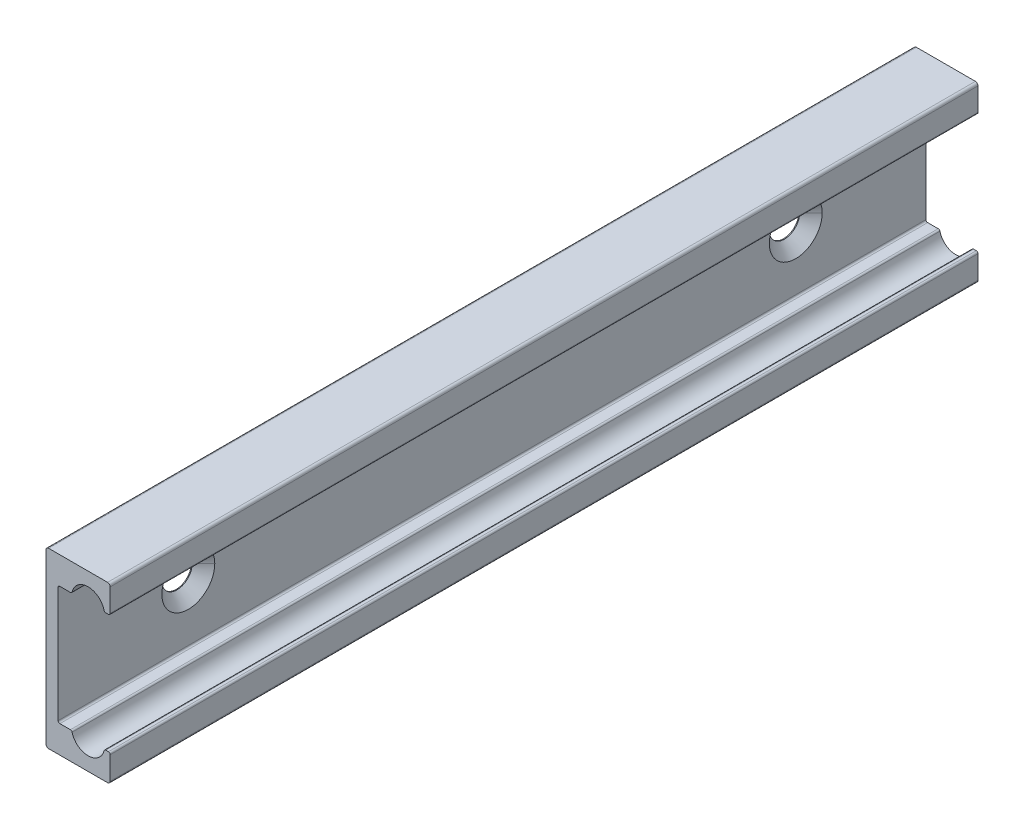
ISO-10303-21;
HEADER;
FILE_DESCRIPTION(('STEP AP214'),'2;1');
FILE_NAME('part.step','',(''),(''),'','','');
FILE_SCHEMA(('AUTOMOTIVE_DESIGN { 1 0 10303 214 1 1 1 1 }'));
ENDSEC;
DATA;
#1=APPLICATION_CONTEXT('core data for automotive mechanical design processes');
#2=APPLICATION_PROTOCOL_DEFINITION('international standard','automotive_design',2000,#1);
#3=PRODUCT_CONTEXT('',#1,'mechanical');
#4=PRODUCT('Part','Part','',(#3));
#5=PRODUCT_RELATED_PRODUCT_CATEGORY('part','',(#4));
#6=PRODUCT_DEFINITION_FORMATION('','',#4);
#7=PRODUCT_DEFINITION_CONTEXT('part definition',#1,'design');
#8=PRODUCT_DEFINITION('design','',#6,#7);
#9=PRODUCT_DEFINITION_SHAPE('','',#8);
#10=(LENGTH_UNIT() NAMED_UNIT(*) SI_UNIT(.MILLI.,.METRE.));
#11=(NAMED_UNIT(*) PLANE_ANGLE_UNIT() SI_UNIT($,.RADIAN.));
#12=(NAMED_UNIT(*) SI_UNIT($,.STERADIAN.) SOLID_ANGLE_UNIT());
#13=UNCERTAINTY_MEASURE_WITH_UNIT(LENGTH_MEASURE(1.E-05),#10,'distance_accuracy_value','');
#14=(GEOMETRIC_REPRESENTATION_CONTEXT(3) GLOBAL_UNCERTAINTY_ASSIGNED_CONTEXT((#13)) GLOBAL_UNIT_ASSIGNED_CONTEXT((#10,
#11,#12)) REPRESENTATION_CONTEXT('',''));
#15=CARTESIAN_POINT('',(0.,0.,0.));
#16=DIRECTION('',(0.,0.,1.));
#17=DIRECTION('',(1.,0.,0.));
#18=AXIS2_PLACEMENT_3D('',#15,#16,#17);
#19=CARTESIAN_POINT('',(-7.10000000000012,19.7,100.));
#20=DIRECTION('',(0.,0.,-1.));
#21=DIRECTION('',(0.707106781186406,-0.707106781186689,0.));
#22=AXIS2_PLACEMENT_3D('',#19,#20,#21);
#23=CYLINDRICAL_SURFACE('',#22,0.29999999999988);
#24=CARTESIAN_POINT('',(-7.10000000000012,19.7,0.));
#25=DIRECTION('',(0.,0.,1.));
#26=DIRECTION('',(1.,0.,0.));
#27=AXIS2_PLACEMENT_3D('',#24,#25,#26);
#28=CIRCLE('',#27,0.29999999999988);
#29=CARTESIAN_POINT('',(-7.1,20.,0.));
#30=VERTEX_POINT('',#29);
#31=CARTESIAN_POINT('',(-7.4,19.7,0.));
#32=VERTEX_POINT('',#31);
#33=EDGE_CURVE('E11',#30,#32,#28,.T.);
#34=ORIENTED_EDGE('',*,*,#33,.T.);
#35=DIRECTION('',(0.,0.,-1.));
#36=VECTOR('',#35,1.);
#37=CARTESIAN_POINT('',(-7.4,19.7,100.));
#38=LINE('',#37,#36);
#39=CARTESIAN_POINT('',(-7.4,19.7,100.));
#40=VERTEX_POINT('',#39);
#41=EDGE_CURVE('E25',#40,#32,#38,.T.);
#42=ORIENTED_EDGE('',*,*,#41,.F.);
#43=CARTESIAN_POINT('',(-7.10000000000012,19.7,100.));
#44=DIRECTION('',(0.,0.,1.));
#45=DIRECTION('',(1.,0.,0.));
#46=AXIS2_PLACEMENT_3D('',#43,#44,#45);
#47=CIRCLE('',#46,0.29999999999988);
#48=CARTESIAN_POINT('',(-7.1,20.,100.));
#49=VERTEX_POINT('',#48);
#50=EDGE_CURVE('E627',#49,#40,#47,.T.);
#51=ORIENTED_EDGE('',*,*,#50,.F.);
#52=DIRECTION('',(0.,0.,-1.));
#53=VECTOR('',#52,1.);
#54=CARTESIAN_POINT('',(-7.1,20.,100.));
#55=LINE('',#54,#53);
#56=EDGE_CURVE('E623',#49,#30,#55,.T.);
#57=ORIENTED_EDGE('',*,*,#56,.T.);
#58=EDGE_LOOP('',(#34,#42,#51,#57));
#59=FACE_BOUND('',#58,.T.);
#60=ADVANCED_FACE('F17',(#59),#23,.T.);
#61=CARTESIAN_POINT('',(-0.3,20.,100.));
#62=DIRECTION('',(0.,-1.,0.));
#63=DIRECTION('',(0.,0.,-1.));
#64=AXIS2_PLACEMENT_3D('',#61,#62,#63);
#65=PLANE('',#64);
#66=DIRECTION('',(-1.,0.,0.));
#67=VECTOR('',#66,1.);
#68=CARTESIAN_POINT('',(-0.3,20.,0.));
#69=LINE('',#68,#67);
#70=CARTESIAN_POINT('',(-0.3,20.,0.));
#71=VERTEX_POINT('',#70);
#72=EDGE_CURVE('E618',#71,#30,#69,.T.);
#73=ORIENTED_EDGE('',*,*,#72,.T.);
#74=ORIENTED_EDGE('',*,*,#56,.F.);
#75=DIRECTION('',(-1.,0.,0.));
#76=VECTOR('',#75,1.);
#77=CARTESIAN_POINT('',(-0.3,20.,100.));
#78=LINE('',#77,#76);
#79=CARTESIAN_POINT('',(-0.3,20.,100.));
#80=VERTEX_POINT('',#79);
#81=EDGE_CURVE('E613',#80,#49,#78,.T.);
#82=ORIENTED_EDGE('',*,*,#81,.F.);
#83=DIRECTION('',(0.,0.,-1.));
#84=VECTOR('',#83,1.);
#85=CARTESIAN_POINT('',(-0.3,20.,100.));
#86=LINE('',#85,#84);
#87=EDGE_CURVE('E609',#80,#71,#86,.T.);
#88=ORIENTED_EDGE('',*,*,#87,.T.);
#89=EDGE_LOOP('',(#73,#74,#82,#88));
#90=FACE_BOUND('',#89,.T.);
#91=ADVANCED_FACE('F644',(#90),#65,.F.);
#92=CARTESIAN_POINT('',(-0.299999999999941,19.7,100.));
#93=DIRECTION('',(0.,0.,-1.));
#94=DIRECTION('',(-0.707106781186478,-0.707106781186617,0.));
#95=AXIS2_PLACEMENT_3D('',#92,#93,#94);
#96=CYLINDRICAL_SURFACE('',#95,0.299999999999941);
#97=CARTESIAN_POINT('',(-0.299999999999941,19.7,0.));
#98=DIRECTION('',(0.,0.,1.));
#99=DIRECTION('',(1.,0.,0.));
#100=AXIS2_PLACEMENT_3D('',#97,#98,#99);
#101=CIRCLE('',#100,0.299999999999941);
#102=CARTESIAN_POINT('',(0.,19.7,0.));
#103=VERTEX_POINT('',#102);
#104=EDGE_CURVE('E604',#103,#71,#101,.T.);
#105=ORIENTED_EDGE('',*,*,#104,.T.);
#106=ORIENTED_EDGE('',*,*,#87,.F.);
#107=CARTESIAN_POINT('',(-0.299999999999941,19.7,100.));
#108=DIRECTION('',(0.,0.,1.));
#109=DIRECTION('',(1.,0.,0.));
#110=AXIS2_PLACEMENT_3D('',#107,#108,#109);
#111=CIRCLE('',#110,0.299999999999941);
#112=CARTESIAN_POINT('',(0.,19.7,100.));
#113=VERTEX_POINT('',#112);
#114=EDGE_CURVE('E599',#113,#80,#111,.T.);
#115=ORIENTED_EDGE('',*,*,#114,.F.);
#116=DIRECTION('',(0.,0.,-1.));
#117=VECTOR('',#116,1.);
#118=CARTESIAN_POINT('',(0.,19.7,100.));
#119=LINE('',#118,#117);
#120=EDGE_CURVE('E595',#113,#103,#119,.T.);
#121=ORIENTED_EDGE('',*,*,#120,.T.);
#122=EDGE_LOOP('',(#105,#106,#115,#121));
#123=FACE_BOUND('',#122,.T.);
#124=ADVANCED_FACE('F734',(#123),#96,.T.);
#125=CARTESIAN_POINT('',(0.,17.05,100.));
#126=DIRECTION('',(-1.,0.,0.));
#127=DIRECTION('',(0.,0.,1.));
#128=AXIS2_PLACEMENT_3D('',#125,#126,#127);
#129=PLANE('',#128);
#130=DIRECTION('',(0.,1.,0.));
#131=VECTOR('',#130,1.);
#132=CARTESIAN_POINT('',(0.,17.05,0.));
#133=LINE('',#132,#131);
#134=CARTESIAN_POINT('',(0.,17.05,0.));
#135=VERTEX_POINT('',#134);
#136=EDGE_CURVE('E590',#135,#103,#133,.T.);
#137=ORIENTED_EDGE('',*,*,#136,.T.);
#138=ORIENTED_EDGE('',*,*,#120,.F.);
#139=DIRECTION('',(0.,1.,0.));
#140=VECTOR('',#139,1.);
#141=CARTESIAN_POINT('',(0.,17.05,100.));
#142=LINE('',#141,#140);
#143=CARTESIAN_POINT('',(0.,17.05,100.));
#144=VERTEX_POINT('',#143);
#145=EDGE_CURVE('E585',#144,#113,#142,.T.);
#146=ORIENTED_EDGE('',*,*,#145,.F.);
#147=DIRECTION('',(0.,0.,-1.));
#148=VECTOR('',#147,1.);
#149=CARTESIAN_POINT('',(0.,17.05,100.));
#150=LINE('',#149,#148);
#151=EDGE_CURVE('E581',#144,#135,#150,.T.);
#152=ORIENTED_EDGE('',*,*,#151,.T.);
#153=EDGE_LOOP('',(#137,#138,#146,#152));
#154=FACE_BOUND('',#153,.T.);
#155=ADVANCED_FACE('F732',(#154),#129,.F.);
#156=CARTESIAN_POINT('',(-0.200000000000533,17.0500000000006,100.));
#157=DIRECTION('',(0.,0.,-1.));
#158=DIRECTION('',(-0.70710678118749,0.707106781185605,0.));
#159=AXIS2_PLACEMENT_3D('',#156,#157,#158);
#160=CYLINDRICAL_SURFACE('',#159,0.200000000000533);
#161=CARTESIAN_POINT('',(-0.200000000000533,17.0500000000006,0.));
#162=DIRECTION('',(0.,0.,1.));
#163=DIRECTION('',(1.,0.,0.));
#164=AXIS2_PLACEMENT_3D('',#161,#162,#163);
#165=CIRCLE('',#164,0.200000000000533);
#166=CARTESIAN_POINT('',(-0.2,16.85,0.));
#167=VERTEX_POINT('',#166);
#168=EDGE_CURVE('E576',#167,#135,#165,.T.);
#169=ORIENTED_EDGE('',*,*,#168,.T.);
#170=ORIENTED_EDGE('',*,*,#151,.F.);
#171=CARTESIAN_POINT('',(-0.200000000000533,17.0500000000006,100.));
#172=DIRECTION('',(0.,0.,1.));
#173=DIRECTION('',(1.,0.,0.));
#174=AXIS2_PLACEMENT_3D('',#171,#172,#173);
#175=CIRCLE('',#174,0.200000000000533);
#176=CARTESIAN_POINT('',(-0.2,16.85,100.));
#177=VERTEX_POINT('',#176);
#178=EDGE_CURVE('E571',#177,#144,#175,.T.);
#179=ORIENTED_EDGE('',*,*,#178,.F.);
#180=DIRECTION('',(0.,0.,-1.));
#181=VECTOR('',#180,1.);
#182=CARTESIAN_POINT('',(-0.2,16.85,100.));
#183=LINE('',#182,#181);
#184=EDGE_CURVE('E567',#177,#167,#183,.T.);
#185=ORIENTED_EDGE('',*,*,#184,.T.);
#186=EDGE_LOOP('',(#169,#170,#179,#185));
#187=FACE_BOUND('',#186,.T.);
#188=ADVANCED_FACE('F727',(#187),#160,.T.);
#189=CARTESIAN_POINT('',(-0.51412795097531,16.85,100.));
#190=DIRECTION('',(0.,1.,0.));
#191=DIRECTION('',(0.,0.,1.));
#192=AXIS2_PLACEMENT_3D('',#189,#190,#191);
#193=PLANE('',#192);
#194=DIRECTION('',(1.,0.,0.));
#195=VECTOR('',#194,1.);
#196=CARTESIAN_POINT('',(-0.51412795097531,16.85,0.));
#197=LINE('',#196,#195);
#198=CARTESIAN_POINT('',(-0.51412795097531,16.85,0.));
#199=VERTEX_POINT('',#198);
#200=EDGE_CURVE('E562',#199,#167,#197,.T.);
#201=ORIENTED_EDGE('',*,*,#200,.T.);
#202=ORIENTED_EDGE('',*,*,#184,.F.);
#203=DIRECTION('',(1.,0.,0.));
#204=VECTOR('',#203,1.);
#205=CARTESIAN_POINT('',(-0.51412795097531,16.85,100.));
#206=LINE('',#205,#204);
#207=CARTESIAN_POINT('',(-0.51412795097531,16.85,100.));
#208=VERTEX_POINT('',#207);
#209=EDGE_CURVE('E557',#208,#177,#206,.T.);
#210=ORIENTED_EDGE('',*,*,#209,.F.);
#211=DIRECTION('',(0.,0.,-1.));
#212=VECTOR('',#211,1.);
#213=CARTESIAN_POINT('',(-0.51412795097531,16.85,100.));
#214=LINE('',#213,#212);
#215=EDGE_CURVE('E553',#208,#199,#214,.T.);
#216=ORIENTED_EDGE('',*,*,#215,.T.);
#217=EDGE_LOOP('',(#201,#202,#210,#216));
#218=FACE_BOUND('',#217,.T.);
#219=ADVANCED_FACE('F724',(#218),#193,.F.);
#220=CARTESIAN_POINT('',(-0.514127950975452,17.05,100.));
#221=DIRECTION('',(0.,0.,-1.));
#222=DIRECTION('',(0.614313404950093,0.789062127147554,0.));
#223=AXIS2_PLACEMENT_3D('',#220,#221,#222);
#224=CYLINDRICAL_SURFACE('',#223,0.199999999999942);
#225=CARTESIAN_POINT('',(-0.514127950975452,17.05,0.));
#226=DIRECTION('',(0.,0.,1.));
#227=DIRECTION('',(1.,0.,0.));
#228=AXIS2_PLACEMENT_3D('',#225,#226,#227);
#229=CIRCLE('',#228,0.199999999999942);
#230=CARTESIAN_POINT('',(-0.7080205270729,17.000952380952,0.));
#231=VERTEX_POINT('',#230);
#232=EDGE_CURVE('E548',#231,#199,#229,.T.);
#233=ORIENTED_EDGE('',*,*,#232,.T.);
#234=ORIENTED_EDGE('',*,*,#215,.F.);
#235=CARTESIAN_POINT('',(-0.514127950975452,17.05,100.));
#236=DIRECTION('',(0.,0.,1.));
#237=DIRECTION('',(1.,0.,0.));
#238=AXIS2_PLACEMENT_3D('',#235,#236,#237);
#239=CIRCLE('',#238,0.199999999999942);
#240=CARTESIAN_POINT('',(-0.7080205270729,17.000952380952,100.));
#241=VERTEX_POINT('',#240);
#242=EDGE_CURVE('E543',#241,#208,#239,.T.);
#243=ORIENTED_EDGE('',*,*,#242,.F.);
#244=DIRECTION('',(0.,0.,-1.));
#245=VECTOR('',#244,1.);
#246=CARTESIAN_POINT('',(-0.7080205270729,17.000952380952,100.));
#247=LINE('',#246,#245);
#248=EDGE_CURVE('E539',#241,#231,#247,.T.);
#249=ORIENTED_EDGE('',*,*,#248,.T.);
#250=EDGE_LOOP('',(#233,#234,#243,#249));
#251=FACE_BOUND('',#250,.T.);
#252=ADVANCED_FACE('F721',(#251),#224,.T.);
#253=CARTESIAN_POINT('',(-2.55,16.535,100.));
#254=DIRECTION('',(0.,0.,-1.));
#255=DIRECTION('',(0.,-1.,0.));
#256=AXIS2_PLACEMENT_3D('',#253,#254,#255);
#257=CYLINDRICAL_SURFACE('',#256,1.89999999999988);
#258=CARTESIAN_POINT('',(-2.55,16.535,0.));
#259=DIRECTION('',(0.,0.,1.));
#260=DIRECTION('',(1.,0.,0.));
#261=AXIS2_PLACEMENT_3D('',#258,#259,#260);
#262=CIRCLE('',#261,1.89999999999988);
#263=CARTESIAN_POINT('',(-4.3919794729271,17.000952380952,0.));
#264=VERTEX_POINT('',#263);
#265=EDGE_CURVE('E534',#231,#264,#262,.T.);
#266=ORIENTED_EDGE('',*,*,#265,.F.);
#267=ORIENTED_EDGE('',*,*,#248,.F.);
#268=CARTESIAN_POINT('',(-2.55,16.535,100.));
#269=DIRECTION('',(0.,0.,1.));
#270=DIRECTION('',(1.,0.,0.));
#271=AXIS2_PLACEMENT_3D('',#268,#269,#270);
#272=CIRCLE('',#271,1.89999999999988);
#273=CARTESIAN_POINT('',(-4.3919794729271,17.000952380952,100.));
#274=VERTEX_POINT('',#273);
#275=EDGE_CURVE('E530',#241,#274,#272,.T.);
#276=ORIENTED_EDGE('',*,*,#275,.T.);
#277=DIRECTION('',(0.,0.,-1.));
#278=VECTOR('',#277,1.);
#279=CARTESIAN_POINT('',(-4.3919794729271,17.000952380952,100.));
#280=LINE('',#279,#278);
#281=EDGE_CURVE('E526',#274,#264,#280,.T.);
#282=ORIENTED_EDGE('',*,*,#281,.T.);
#283=EDGE_LOOP('',(#266,#267,#276,#282));
#284=FACE_BOUND('',#283,.T.);
#285=ADVANCED_FACE('F715',(#284),#257,.F.);
#286=CARTESIAN_POINT('',(-4.58587204902462,17.05,100.));
#287=DIRECTION('',(0.,0.,-1.));
#288=DIRECTION('',(-0.614313404950262,0.789062127147423,0.));
#289=AXIS2_PLACEMENT_3D('',#286,#287,#288);
#290=CYLINDRICAL_SURFACE('',#289,0.20000000000003);
#291=CARTESIAN_POINT('',(-4.58587204902462,17.05,0.));
#292=DIRECTION('',(0.,0.,1.));
#293=DIRECTION('',(1.,0.,0.));
#294=AXIS2_PLACEMENT_3D('',#291,#292,#293);
#295=CIRCLE('',#294,0.20000000000003);
#296=CARTESIAN_POINT('',(-4.5858720490247,16.85,0.));
#297=VERTEX_POINT('',#296);
#298=EDGE_CURVE('E521',#297,#264,#295,.T.);
#299=ORIENTED_EDGE('',*,*,#298,.T.);
#300=ORIENTED_EDGE('',*,*,#281,.F.);
#301=CARTESIAN_POINT('',(-4.58587204902462,17.05,100.));
#302=DIRECTION('',(0.,0.,1.));
#303=DIRECTION('',(1.,0.,0.));
#304=AXIS2_PLACEMENT_3D('',#301,#302,#303);
#305=CIRCLE('',#304,0.20000000000003);
#306=CARTESIAN_POINT('',(-4.5858720490247,16.85,100.));
#307=VERTEX_POINT('',#306);
#308=EDGE_CURVE('E516',#307,#274,#305,.T.);
#309=ORIENTED_EDGE('',*,*,#308,.F.);
#310=DIRECTION('',(0.,0.,-1.));
#311=VECTOR('',#310,1.);
#312=CARTESIAN_POINT('',(-4.5858720490247,16.85,100.));
#313=LINE('',#312,#311);
#314=EDGE_CURVE('E512',#307,#297,#313,.T.);
#315=ORIENTED_EDGE('',*,*,#314,.T.);
#316=EDGE_LOOP('',(#299,#300,#309,#315));
#317=FACE_BOUND('',#316,.T.);
#318=ADVANCED_FACE('F712',(#317),#290,.T.);
#319=CARTESIAN_POINT('',(-5.8,16.85,100.));
#320=DIRECTION('',(0.,1.,0.));
#321=DIRECTION('',(0.,0.,1.));
#322=AXIS2_PLACEMENT_3D('',#319,#320,#321);
#323=PLANE('',#322);
#324=DIRECTION('',(1.,0.,0.));
#325=VECTOR('',#324,1.);
#326=CARTESIAN_POINT('',(-5.8,16.85,0.));
#327=LINE('',#326,#325);
#328=CARTESIAN_POINT('',(-5.8,16.85,0.));
#329=VERTEX_POINT('',#328);
#330=EDGE_CURVE('E507',#329,#297,#327,.T.);
#331=ORIENTED_EDGE('',*,*,#330,.T.);
#332=ORIENTED_EDGE('',*,*,#314,.F.);
#333=DIRECTION('',(1.,0.,0.));
#334=VECTOR('',#333,1.);
#335=CARTESIAN_POINT('',(-5.8,16.85,100.));
#336=LINE('',#335,#334);
#337=CARTESIAN_POINT('',(-5.8,16.85,100.));
#338=VERTEX_POINT('',#337);
#339=EDGE_CURVE('E502',#338,#307,#336,.T.);
#340=ORIENTED_EDGE('',*,*,#339,.F.);
#341=DIRECTION('',(0.,0.,-1.));
#342=VECTOR('',#341,1.);
#343=CARTESIAN_POINT('',(-5.8,16.85,100.));
#344=LINE('',#343,#342);
#345=EDGE_CURVE('E498',#338,#329,#344,.T.);
#346=ORIENTED_EDGE('',*,*,#345,.T.);
#347=EDGE_LOOP('',(#331,#332,#340,#346));
#348=FACE_BOUND('',#347,.T.);
#349=ADVANCED_FACE('F709',(#348),#323,.F.);
#350=CARTESIAN_POINT('',(-5.79999999999945,16.6499999999995,100.));
#351=DIRECTION('',(0.,0.,-1.));
#352=DIRECTION('',(0.707106781186546,-0.707106781186549,0.));
#353=AXIS2_PLACEMENT_3D('',#350,#351,#352);
#354=CYLINDRICAL_SURFACE('',#353,0.200000000000548);
#355=CARTESIAN_POINT('',(-5.79999999999945,16.6499999999995,0.));
#356=DIRECTION('',(0.,0.,1.));
#357=DIRECTION('',(1.,0.,0.));
#358=AXIS2_PLACEMENT_3D('',#355,#356,#357);
#359=CIRCLE('',#358,0.200000000000548);
#360=CARTESIAN_POINT('',(-6.,16.65,0.));
#361=VERTEX_POINT('',#360);
#362=EDGE_CURVE('E493',#329,#361,#359,.T.);
#363=ORIENTED_EDGE('',*,*,#362,.F.);
#364=ORIENTED_EDGE('',*,*,#345,.F.);
#365=CARTESIAN_POINT('',(-5.79999999999945,16.6499999999995,100.));
#366=DIRECTION('',(0.,0.,1.));
#367=DIRECTION('',(1.,0.,0.));
#368=AXIS2_PLACEMENT_3D('',#365,#366,#367);
#369=CIRCLE('',#368,0.200000000000548);
#370=CARTESIAN_POINT('',(-6.,16.65,100.));
#371=VERTEX_POINT('',#370);
#372=EDGE_CURVE('E489',#338,#371,#369,.T.);
#373=ORIENTED_EDGE('',*,*,#372,.T.);
#374=DIRECTION('',(0.,0.,-1.));
#375=VECTOR('',#374,1.);
#376=CARTESIAN_POINT('',(-6.,16.65,100.));
#377=LINE('',#376,#375);
#378=EDGE_CURVE('E485',#371,#361,#377,.T.);
#379=ORIENTED_EDGE('',*,*,#378,.T.);
#380=EDGE_LOOP('',(#363,#364,#373,#379));
#381=FACE_BOUND('',#380,.T.);
#382=ADVANCED_FACE('F702',(#381),#354,.F.);
#383=CARTESIAN_POINT('',(-6.,3.35,100.));
#384=DIRECTION('',(-1.,0.,0.));
#385=DIRECTION('',(0.,0.,1.));
#386=AXIS2_PLACEMENT_3D('',#383,#384,#385);
#387=PLANE('',#386);
#388=CARTESIAN_POINT('',(-6.,10.,85.));
#389=DIRECTION('',(1.,0.,0.));
#390=DIRECTION('',(0.,0.,-1.));
#391=AXIS2_PLACEMENT_3D('',#388,#389,#390);
#392=CIRCLE('',#391,3.05);
#393=CARTESIAN_POINT('',(-6.,10.,88.05));
#394=VERTEX_POINT('',#393);
#395=CARTESIAN_POINT('',(-6.,10.,81.95));
#396=VERTEX_POINT('',#395);
#397=EDGE_CURVE('E227',#394,#396,#392,.T.);
#398=ORIENTED_EDGE('',*,*,#397,.F.);
#399=CARTESIAN_POINT('',(-6.,10.,85.));
#400=DIRECTION('',(1.,0.,0.));
#401=DIRECTION('',(0.,0.,-1.));
#402=AXIS2_PLACEMENT_3D('',#399,#400,#401);
#403=CIRCLE('',#402,3.05);
#404=EDGE_CURVE('E478',#396,#394,#403,.T.);
#405=ORIENTED_EDGE('',*,*,#404,.F.);
#406=EDGE_LOOP('',(#398,#405));
#407=FACE_BOUND('',#406,.T.);
#408=CARTESIAN_POINT('',(-6.,10.,15.));
#409=DIRECTION('',(1.,0.,0.));
#410=DIRECTION('',(0.,0.,-1.));
#411=AXIS2_PLACEMENT_3D('',#408,#409,#410);
#412=CIRCLE('',#411,3.05);
#413=CARTESIAN_POINT('',(-6.,10.,18.05));
#414=VERTEX_POINT('',#413);
#415=CARTESIAN_POINT('',(-6.,10.,11.95));
#416=VERTEX_POINT('',#415);
#417=EDGE_CURVE('E473',#414,#416,#412,.T.);
#418=ORIENTED_EDGE('',*,*,#417,.F.);
#419=CARTESIAN_POINT('',(-6.,10.,15.));
#420=DIRECTION('',(1.,0.,0.));
#421=DIRECTION('',(0.,0.,-1.));
#422=AXIS2_PLACEMENT_3D('',#419,#420,#421);
#423=CIRCLE('',#422,3.05);
#424=EDGE_CURVE('E468',#416,#414,#423,.T.);
#425=ORIENTED_EDGE('',*,*,#424,.F.);
#426=EDGE_LOOP('',(#418,#425));
#427=FACE_BOUND('',#426,.T.);
#428=DIRECTION('',(0.,1.,0.));
#429=VECTOR('',#428,1.);
#430=CARTESIAN_POINT('',(-6.,3.35,0.));
#431=LINE('',#430,#429);
#432=CARTESIAN_POINT('',(-6.,3.35,0.));
#433=VERTEX_POINT('',#432);
#434=EDGE_CURVE('E463',#433,#361,#431,.T.);
#435=ORIENTED_EDGE('',*,*,#434,.T.);
#436=ORIENTED_EDGE('',*,*,#378,.F.);
#437=DIRECTION('',(0.,1.,0.));
#438=VECTOR('',#437,1.);
#439=CARTESIAN_POINT('',(-6.,3.35,100.));
#440=LINE('',#439,#438);
#441=CARTESIAN_POINT('',(-6.,3.35,100.));
#442=VERTEX_POINT('',#441);
#443=EDGE_CURVE('E458',#442,#371,#440,.T.);
#444=ORIENTED_EDGE('',*,*,#443,.F.);
#445=DIRECTION('',(0.,0.,-1.));
#446=VECTOR('',#445,1.);
#447=CARTESIAN_POINT('',(-6.,3.35,100.));
#448=LINE('',#447,#446);
#449=EDGE_CURVE('E454',#442,#433,#448,.T.);
#450=ORIENTED_EDGE('',*,*,#449,.T.);
#451=EDGE_LOOP('',(#435,#436,#444,#450));
#452=FACE_BOUND('',#451,.T.);
#453=ADVANCED_FACE('F699',(#407,#427,#452),#387,.F.);
#454=CARTESIAN_POINT('',(-5.8,3.35,100.));
#455=DIRECTION('',(0.,0.,-1.));
#456=DIRECTION('',(0.707106781186548,0.707106781186547,0.));
#457=AXIS2_PLACEMENT_3D('',#454,#455,#456);
#458=CYLINDRICAL_SURFACE('',#457,0.200000000000032);
#459=CARTESIAN_POINT('',(-5.8,3.35,0.));
#460=DIRECTION('',(0.,0.,1.));
#461=DIRECTION('',(1.,0.,0.));
#462=AXIS2_PLACEMENT_3D('',#459,#460,#461);
#463=CIRCLE('',#462,0.200000000000032);
#464=CARTESIAN_POINT('',(-5.8,3.15,0.));
#465=VERTEX_POINT('',#464);
#466=EDGE_CURVE('E449',#433,#465,#463,.T.);
#467=ORIENTED_EDGE('',*,*,#466,.F.);
#468=ORIENTED_EDGE('',*,*,#449,.F.);
#469=CARTESIAN_POINT('',(-5.8,3.35,100.));
#470=DIRECTION('',(0.,0.,1.));
#471=DIRECTION('',(1.,0.,0.));
#472=AXIS2_PLACEMENT_3D('',#469,#470,#471);
#473=CIRCLE('',#472,0.200000000000032);
#474=CARTESIAN_POINT('',(-5.8,3.15,100.));
#475=VERTEX_POINT('',#474);
#476=EDGE_CURVE('E445',#442,#475,#473,.T.);
#477=ORIENTED_EDGE('',*,*,#476,.T.);
#478=DIRECTION('',(0.,0.,-1.));
#479=VECTOR('',#478,1.);
#480=CARTESIAN_POINT('',(-5.8,3.15,100.));
#481=LINE('',#480,#479);
#482=EDGE_CURVE('E441',#475,#465,#481,.T.);
#483=ORIENTED_EDGE('',*,*,#482,.T.);
#484=EDGE_LOOP('',(#467,#468,#477,#483));
#485=FACE_BOUND('',#484,.T.);
#486=ADVANCED_FACE('F696',(#485),#458,.F.);
#487=CARTESIAN_POINT('',(-4.5858720490247,3.15,100.));
#488=DIRECTION('',(0.,-1.,0.));
#489=DIRECTION('',(0.,0.,-1.));
#490=AXIS2_PLACEMENT_3D('',#487,#488,#489);
#491=PLANE('',#490);
#492=DIRECTION('',(-1.,0.,0.));
#493=VECTOR('',#492,1.);
#494=CARTESIAN_POINT('',(-4.5858720490247,3.15,0.));
#495=LINE('',#494,#493);
#496=CARTESIAN_POINT('',(-4.5858720490247,3.15,0.));
#497=VERTEX_POINT('',#496);
#498=EDGE_CURVE('E436',#497,#465,#495,.T.);
#499=ORIENTED_EDGE('',*,*,#498,.T.);
#500=ORIENTED_EDGE('',*,*,#482,.F.);
#501=DIRECTION('',(-1.,0.,0.));
#502=VECTOR('',#501,1.);
#503=CARTESIAN_POINT('',(-4.5858720490247,3.15,100.));
#504=LINE('',#503,#502);
#505=CARTESIAN_POINT('',(-4.5858720490247,3.15,100.));
#506=VERTEX_POINT('',#505);
#507=EDGE_CURVE('E431',#506,#475,#504,.T.);
#508=ORIENTED_EDGE('',*,*,#507,.F.);
#509=DIRECTION('',(0.,0.,-1.));
#510=VECTOR('',#509,1.);
#511=CARTESIAN_POINT('',(-4.5858720490247,3.15,100.));
#512=LINE('',#511,#510);
#513=EDGE_CURVE('E427',#506,#497,#512,.T.);
#514=ORIENTED_EDGE('',*,*,#513,.T.);
#515=EDGE_LOOP('',(#499,#500,#508,#514));
#516=FACE_BOUND('',#515,.T.);
#517=ADVANCED_FACE('F688',(#516),#491,.F.);
#518=CARTESIAN_POINT('',(-4.58587204902477,2.94999999999991,100.));
#519=DIRECTION('',(0.,0.,-1.));
#520=DIRECTION('',(-0.61431340495122,-0.789062127146677,0.));
#521=AXIS2_PLACEMENT_3D('',#518,#519,#520);
#522=CYLINDRICAL_SURFACE('',#521,0.20000000000009);
#523=CARTESIAN_POINT('',(-4.58587204902477,2.94999999999991,0.));
#524=DIRECTION('',(0.,0.,1.));
#525=DIRECTION('',(1.,0.,0.));
#526=AXIS2_PLACEMENT_3D('',#523,#524,#525);
#527=CIRCLE('',#526,0.20000000000009);
#528=CARTESIAN_POINT('',(-4.3919794729271,2.9990476190476,0.));
#529=VERTEX_POINT('',#528);
#530=EDGE_CURVE('E422',#529,#497,#527,.T.);
#531=ORIENTED_EDGE('',*,*,#530,.T.);
#532=ORIENTED_EDGE('',*,*,#513,.F.);
#533=CARTESIAN_POINT('',(-4.58587204902477,2.94999999999991,100.));
#534=DIRECTION('',(0.,0.,1.));
#535=DIRECTION('',(1.,0.,0.));
#536=AXIS2_PLACEMENT_3D('',#533,#534,#535);
#537=CIRCLE('',#536,0.20000000000009);
#538=CARTESIAN_POINT('',(-4.3919794729271,2.9990476190476,100.));
#539=VERTEX_POINT('',#538);
#540=EDGE_CURVE('E417',#539,#506,#537,.T.);
#541=ORIENTED_EDGE('',*,*,#540,.F.);
#542=DIRECTION('',(0.,0.,-1.));
#543=VECTOR('',#542,1.);
#544=CARTESIAN_POINT('',(-4.3919794729271,2.9990476190476,100.));
#545=LINE('',#544,#543);
#546=EDGE_CURVE('E413',#539,#529,#545,.T.);
#547=ORIENTED_EDGE('',*,*,#546,.T.);
#548=EDGE_LOOP('',(#531,#532,#541,#547));
#549=FACE_BOUND('',#548,.T.);
#550=ADVANCED_FACE('F685',(#549),#522,.T.);
#551=CARTESIAN_POINT('',(-2.55,3.465,100.));
#552=DIRECTION('',(0.,0.,-1.));
#553=DIRECTION('',(0.,1.,0.));
#554=AXIS2_PLACEMENT_3D('',#551,#552,#553);
#555=CYLINDRICAL_SURFACE('',#554,1.9);
#556=CARTESIAN_POINT('',(-2.55,3.465,0.));
#557=DIRECTION('',(0.,0.,1.));
#558=DIRECTION('',(1.,0.,0.));
#559=AXIS2_PLACEMENT_3D('',#556,#557,#558);
#560=CIRCLE('',#559,1.9);
#561=CARTESIAN_POINT('',(-0.7080205270729,2.9990476190476,0.));
#562=VERTEX_POINT('',#561);
#563=EDGE_CURVE('E408',#529,#562,#560,.T.);
#564=ORIENTED_EDGE('',*,*,#563,.F.);
#565=ORIENTED_EDGE('',*,*,#546,.F.);
#566=CARTESIAN_POINT('',(-2.55,3.465,100.));
#567=DIRECTION('',(0.,0.,1.));
#568=DIRECTION('',(1.,0.,0.));
#569=AXIS2_PLACEMENT_3D('',#566,#567,#568);
#570=CIRCLE('',#569,1.9);
#571=CARTESIAN_POINT('',(-0.7080205270729,2.9990476190476,100.));
#572=VERTEX_POINT('',#571);
#573=EDGE_CURVE('E404',#539,#572,#570,.T.);
#574=ORIENTED_EDGE('',*,*,#573,.T.);
#575=DIRECTION('',(0.,0.,-1.));
#576=VECTOR('',#575,1.);
#577=CARTESIAN_POINT('',(-0.7080205270729,2.9990476190476,100.));
#578=LINE('',#577,#576);
#579=EDGE_CURVE('E400',#572,#562,#578,.T.);
#580=ORIENTED_EDGE('',*,*,#579,.T.);
#581=EDGE_LOOP('',(#564,#565,#574,#580));
#582=FACE_BOUND('',#581,.T.);
#583=ADVANCED_FACE('F682',(#582),#555,.F.);
#584=CARTESIAN_POINT('',(-0.514127950975306,2.95,100.));
#585=DIRECTION('',(0.,0.,-1.));
#586=DIRECTION('',(0.614313404951226,-0.789062127146672,0.));
#587=AXIS2_PLACEMENT_3D('',#584,#585,#586);
#588=CYLINDRICAL_SURFACE('',#587,0.2);
#589=CARTESIAN_POINT('',(-0.514127950975306,2.95,0.));
#590=DIRECTION('',(0.,0.,1.));
#591=DIRECTION('',(1.,0.,0.));
#592=AXIS2_PLACEMENT_3D('',#589,#590,#591);
#593=CIRCLE('',#592,0.2);
#594=CARTESIAN_POINT('',(-0.51412795097531,3.15,0.));
#595=VERTEX_POINT('',#594);
#596=EDGE_CURVE('E395',#595,#562,#593,.T.);
#597=ORIENTED_EDGE('',*,*,#596,.T.);
#598=ORIENTED_EDGE('',*,*,#579,.F.);
#599=CARTESIAN_POINT('',(-0.514127950975306,2.95,100.));
#600=DIRECTION('',(0.,0.,1.));
#601=DIRECTION('',(1.,0.,0.));
#602=AXIS2_PLACEMENT_3D('',#599,#600,#601);
#603=CIRCLE('',#602,0.2);
#604=CARTESIAN_POINT('',(-0.51412795097531,3.15,100.));
#605=VERTEX_POINT('',#604);
#606=EDGE_CURVE('E390',#605,#572,#603,.T.);
#607=ORIENTED_EDGE('',*,*,#606,.F.);
#608=DIRECTION('',(0.,0.,-1.));
#609=VECTOR('',#608,1.);
#610=CARTESIAN_POINT('',(-0.51412795097531,3.15,100.));
#611=LINE('',#610,#609);
#612=EDGE_CURVE('E386',#605,#595,#611,.T.);
#613=ORIENTED_EDGE('',*,*,#612,.T.);
#614=EDGE_LOOP('',(#597,#598,#607,#613));
#615=FACE_BOUND('',#614,.T.);
#616=ADVANCED_FACE('F675',(#615),#588,.T.);
#617=CARTESIAN_POINT('',(-0.2,3.15,100.));
#618=DIRECTION('',(0.,-1.,0.));
#619=DIRECTION('',(0.,0.,-1.));
#620=AXIS2_PLACEMENT_3D('',#617,#618,#619);
#621=PLANE('',#620);
#622=DIRECTION('',(-1.,0.,0.));
#623=VECTOR('',#622,1.);
#624=CARTESIAN_POINT('',(-0.2,3.15,0.));
#625=LINE('',#624,#623);
#626=CARTESIAN_POINT('',(-0.2,3.15,0.));
#627=VERTEX_POINT('',#626);
#628=EDGE_CURVE('E381',#627,#595,#625,.T.);
#629=ORIENTED_EDGE('',*,*,#628,.T.);
#630=ORIENTED_EDGE('',*,*,#612,.F.);
#631=DIRECTION('',(-1.,0.,0.));
#632=VECTOR('',#631,1.);
#633=CARTESIAN_POINT('',(-0.2,3.15,100.));
#634=LINE('',#633,#632);
#635=CARTESIAN_POINT('',(-0.2,3.15,100.));
#636=VERTEX_POINT('',#635);
#637=EDGE_CURVE('E376',#636,#605,#634,.T.);
#638=ORIENTED_EDGE('',*,*,#637,.F.);
#639=DIRECTION('',(0.,0.,-1.));
#640=VECTOR('',#639,1.);
#641=CARTESIAN_POINT('',(-0.2,3.15,100.));
#642=LINE('',#641,#640);
#643=EDGE_CURVE('E372',#636,#627,#642,.T.);
#644=ORIENTED_EDGE('',*,*,#643,.T.);
#645=EDGE_LOOP('',(#629,#630,#638,#644));
#646=FACE_BOUND('',#645,.T.);
#647=ADVANCED_FACE('F672',(#646),#621,.F.);
#648=CARTESIAN_POINT('',(-0.200000000000015,2.95,100.));
#649=DIRECTION('',(0.,0.,-1.));
#650=DIRECTION('',(-0.707106781186575,-0.70710678118652,0.));
#651=AXIS2_PLACEMENT_3D('',#648,#649,#650);
#652=CYLINDRICAL_SURFACE('',#651,0.200000000000015);
#653=CARTESIAN_POINT('',(-0.200000000000015,2.95,0.));
#654=DIRECTION('',(0.,0.,1.));
#655=DIRECTION('',(1.,0.,0.));
#656=AXIS2_PLACEMENT_3D('',#653,#654,#655);
#657=CIRCLE('',#656,0.200000000000015);
#658=CARTESIAN_POINT('',(0.,2.95,0.));
#659=VERTEX_POINT('',#658);
#660=EDGE_CURVE('E367',#659,#627,#657,.T.);
#661=ORIENTED_EDGE('',*,*,#660,.T.);
#662=ORIENTED_EDGE('',*,*,#643,.F.);
#663=CARTESIAN_POINT('',(-0.200000000000015,2.95,100.));
#664=DIRECTION('',(0.,0.,1.));
#665=DIRECTION('',(1.,0.,0.));
#666=AXIS2_PLACEMENT_3D('',#663,#664,#665);
#667=CIRCLE('',#666,0.200000000000015);
#668=CARTESIAN_POINT('',(0.,2.95,100.));
#669=VERTEX_POINT('',#668);
#670=EDGE_CURVE('E362',#669,#636,#667,.T.);
#671=ORIENTED_EDGE('',*,*,#670,.F.);
#672=DIRECTION('',(0.,0.,-1.));
#673=VECTOR('',#672,1.);
#674=CARTESIAN_POINT('',(0.,2.95,100.));
#675=LINE('',#674,#673);
#676=EDGE_CURVE('E358',#669,#659,#675,.T.);
#677=ORIENTED_EDGE('',*,*,#676,.T.);
#678=EDGE_LOOP('',(#661,#662,#671,#677));
#679=FACE_BOUND('',#678,.T.);
#680=ADVANCED_FACE('F669',(#679),#652,.T.);
#681=CARTESIAN_POINT('',(0.,0.3,100.));
#682=DIRECTION('',(-1.,0.,0.));
#683=DIRECTION('',(0.,0.,1.));
#684=AXIS2_PLACEMENT_3D('',#681,#682,#683);
#685=PLANE('',#684);
#686=DIRECTION('',(0.,1.,0.));
#687=VECTOR('',#686,1.);
#688=CARTESIAN_POINT('',(0.,0.3,0.));
#689=LINE('',#688,#687);
#690=CARTESIAN_POINT('',(0.,0.3,0.));
#691=VERTEX_POINT('',#690);
#692=EDGE_CURVE('E353',#691,#659,#689,.T.);
#693=ORIENTED_EDGE('',*,*,#692,.T.);
#694=ORIENTED_EDGE('',*,*,#676,.F.);
#695=DIRECTION('',(0.,1.,0.));
#696=VECTOR('',#695,1.);
#697=CARTESIAN_POINT('',(0.,0.3,100.));
#698=LINE('',#697,#696);
#699=CARTESIAN_POINT('',(0.,0.3,100.));
#700=VERTEX_POINT('',#699);
#701=EDGE_CURVE('E348',#700,#669,#698,.T.);
#702=ORIENTED_EDGE('',*,*,#701,.F.);
#703=DIRECTION('',(0.,0.,-1.));
#704=VECTOR('',#703,1.);
#705=CARTESIAN_POINT('',(0.,0.3,100.));
#706=LINE('',#705,#704);
#707=EDGE_CURVE('E344',#700,#691,#706,.T.);
#708=ORIENTED_EDGE('',*,*,#707,.T.);
#709=EDGE_LOOP('',(#693,#694,#702,#708));
#710=FACE_BOUND('',#709,.T.);
#711=ADVANCED_FACE('F663',(#710),#685,.F.);
#712=CARTESIAN_POINT('',(-0.3,0.3,100.));
#713=DIRECTION('',(0.,0.,-1.));
#714=DIRECTION('',(-0.707106781186548,0.707106781186547,0.));
#715=AXIS2_PLACEMENT_3D('',#712,#713,#714);
#716=CYLINDRICAL_SURFACE('',#715,0.3);
#717=CARTESIAN_POINT('',(-0.3,0.3,0.));
#718=DIRECTION('',(0.,0.,1.));
#719=DIRECTION('',(1.,0.,0.));
#720=AXIS2_PLACEMENT_3D('',#717,#718,#719);
#721=CIRCLE('',#720,0.3);
#722=CARTESIAN_POINT('',(-0.3,0.,0.));
#723=VERTEX_POINT('',#722);
#724=EDGE_CURVE('E339',#723,#691,#721,.T.);
#725=ORIENTED_EDGE('',*,*,#724,.T.);
#726=ORIENTED_EDGE('',*,*,#707,.F.);
#727=CARTESIAN_POINT('',(-0.3,0.3,100.));
#728=DIRECTION('',(0.,0.,1.));
#729=DIRECTION('',(1.,0.,0.));
#730=AXIS2_PLACEMENT_3D('',#727,#728,#729);
#731=CIRCLE('',#730,0.3);
#732=CARTESIAN_POINT('',(-0.3,0.,100.));
#733=VERTEX_POINT('',#732);
#734=EDGE_CURVE('E334',#733,#700,#731,.T.);
#735=ORIENTED_EDGE('',*,*,#734,.F.);
#736=DIRECTION('',(0.,0.,-1.));
#737=VECTOR('',#736,1.);
#738=CARTESIAN_POINT('',(-0.3,0.,100.));
#739=LINE('',#738,#737);
#740=EDGE_CURVE('E330',#733,#723,#739,.T.);
#741=ORIENTED_EDGE('',*,*,#740,.T.);
#742=EDGE_LOOP('',(#725,#726,#735,#741));
#743=FACE_BOUND('',#742,.T.);
#744=ADVANCED_FACE('F660',(#743),#716,.T.);
#745=CARTESIAN_POINT('',(-7.1,0.,100.));
#746=DIRECTION('',(0.,1.,0.));
#747=DIRECTION('',(0.,0.,1.));
#748=AXIS2_PLACEMENT_3D('',#745,#746,#747);
#749=PLANE('',#748);
#750=DIRECTION('',(1.,0.,0.));
#751=VECTOR('',#750,1.);
#752=CARTESIAN_POINT('',(-7.1,0.,0.));
#753=LINE('',#752,#751);
#754=CARTESIAN_POINT('',(-7.1,0.,0.));
#755=VERTEX_POINT('',#754);
#756=EDGE_CURVE('E325',#755,#723,#753,.T.);
#757=ORIENTED_EDGE('',*,*,#756,.T.);
#758=ORIENTED_EDGE('',*,*,#740,.F.);
#759=DIRECTION('',(1.,0.,0.));
#760=VECTOR('',#759,1.);
#761=CARTESIAN_POINT('',(-7.1,0.,100.));
#762=LINE('',#761,#760);
#763=CARTESIAN_POINT('',(-7.1,0.,100.));
#764=VERTEX_POINT('',#763);
#765=EDGE_CURVE('E320',#764,#733,#762,.T.);
#766=ORIENTED_EDGE('',*,*,#765,.F.);
#767=DIRECTION('',(0.,0.,-1.));
#768=VECTOR('',#767,1.);
#769=CARTESIAN_POINT('',(-7.1,0.,100.));
#770=LINE('',#769,#768);
#771=EDGE_CURVE('E316',#764,#755,#770,.T.);
#772=ORIENTED_EDGE('',*,*,#771,.T.);
#773=EDGE_LOOP('',(#757,#758,#766,#772));
#774=FACE_BOUND('',#773,.T.);
#775=ADVANCED_FACE('F658',(#774),#749,.F.);
#776=CARTESIAN_POINT('',(-7.1,0.299999999999941,100.));
#777=DIRECTION('',(0.,0.,-1.));
#778=DIRECTION('',(0.707106781186617,0.707106781186478,0.));
#779=AXIS2_PLACEMENT_3D('',#776,#777,#778);
#780=CYLINDRICAL_SURFACE('',#779,0.299999999999942);
#781=CARTESIAN_POINT('',(-7.1,0.299999999999941,0.));
#782=DIRECTION('',(0.,0.,1.));
#783=DIRECTION('',(1.,0.,0.));
#784=AXIS2_PLACEMENT_3D('',#781,#782,#783);
#785=CIRCLE('',#784,0.299999999999942);
#786=CARTESIAN_POINT('',(-7.4,0.3,0.));
#787=VERTEX_POINT('',#786);
#788=EDGE_CURVE('E311',#787,#755,#785,.T.);
#789=ORIENTED_EDGE('',*,*,#788,.T.);
#790=ORIENTED_EDGE('',*,*,#771,.F.);
#791=CARTESIAN_POINT('',(-7.1,0.299999999999941,100.));
#792=DIRECTION('',(0.,0.,1.));
#793=DIRECTION('',(1.,0.,0.));
#794=AXIS2_PLACEMENT_3D('',#791,#792,#793);
#795=CIRCLE('',#794,0.299999999999942);
#796=CARTESIAN_POINT('',(-7.4,0.3,100.));
#797=VERTEX_POINT('',#796);
#798=EDGE_CURVE('E306',#797,#764,#795,.T.);
#799=ORIENTED_EDGE('',*,*,#798,.F.);
#800=DIRECTION('',(0.,0.,-1.));
#801=VECTOR('',#800,1.);
#802=CARTESIAN_POINT('',(-7.4,0.3,100.));
#803=LINE('',#802,#801);
#804=EDGE_CURVE('E302',#797,#787,#803,.T.);
#805=ORIENTED_EDGE('',*,*,#804,.T.);
#806=EDGE_LOOP('',(#789,#790,#799,#805));
#807=FACE_BOUND('',#806,.T.);
#808=ADVANCED_FACE('F654',(#807),#780,.T.);
#809=CARTESIAN_POINT('',(-7.4,19.7,100.));
#810=DIRECTION('',(1.,0.,0.));
#811=DIRECTION('',(0.,0.,-1.));
#812=AXIS2_PLACEMENT_3D('',#809,#810,#811);
#813=PLANE('',#812);
#814=CARTESIAN_POINT('',(-7.4,10.,85.));
#815=DIRECTION('',(1.,0.,0.));
#816=DIRECTION('',(0.,0.,-1.));
#817=AXIS2_PLACEMENT_3D('',#814,#815,#816);
#818=CIRCLE('',#817,1.75);
#819=CARTESIAN_POINT('',(-7.4,10.,83.25));
#820=VERTEX_POINT('',#819);
#821=CARTESIAN_POINT('',(-7.4,10.,86.75));
#822=VERTEX_POINT('',#821);
#823=EDGE_CURVE('E239',#820,#822,#818,.T.);
#824=ORIENTED_EDGE('',*,*,#823,.T.);
#825=CARTESIAN_POINT('',(-7.4,10.,85.));
#826=DIRECTION('',(1.,0.,0.));
#827=DIRECTION('',(0.,0.,-1.));
#828=AXIS2_PLACEMENT_3D('',#825,#826,#827);
#829=CIRCLE('',#828,1.75);
#830=EDGE_CURVE('E295',#822,#820,#829,.T.);
#831=ORIENTED_EDGE('',*,*,#830,.T.);
#832=EDGE_LOOP('',(#824,#831));
#833=FACE_BOUND('',#832,.T.);
#834=CARTESIAN_POINT('',(-7.4,10.,15.));
#835=DIRECTION('',(1.,0.,0.));
#836=DIRECTION('',(0.,0.,-1.));
#837=AXIS2_PLACEMENT_3D('',#834,#835,#836);
#838=CIRCLE('',#837,1.75);
#839=CARTESIAN_POINT('',(-7.4,10.,13.25));
#840=VERTEX_POINT('',#839);
#841=CARTESIAN_POINT('',(-7.4,10.,16.75));
#842=VERTEX_POINT('',#841);
#843=EDGE_CURVE('E291',#840,#842,#838,.T.);
#844=ORIENTED_EDGE('',*,*,#843,.T.);
#845=CARTESIAN_POINT('',(-7.4,10.,15.));
#846=DIRECTION('',(1.,0.,0.));
#847=DIRECTION('',(0.,0.,-1.));
#848=AXIS2_PLACEMENT_3D('',#845,#846,#847);
#849=CIRCLE('',#848,1.75);
#850=EDGE_CURVE('E287',#842,#840,#849,.T.);
#851=ORIENTED_EDGE('',*,*,#850,.T.);
#852=EDGE_LOOP('',(#844,#851));
#853=FACE_BOUND('',#852,.T.);
#854=DIRECTION('',(0.,-1.,0.));
#855=VECTOR('',#854,1.);
#856=CARTESIAN_POINT('',(-7.4,19.7,0.));
#857=LINE('',#856,#855);
#858=EDGE_CURVE('E282',#32,#787,#857,.T.);
#859=ORIENTED_EDGE('',*,*,#858,.T.);
#860=ORIENTED_EDGE('',*,*,#804,.F.);
#861=DIRECTION('',(0.,-1.,0.));
#862=VECTOR('',#861,1.);
#863=CARTESIAN_POINT('',(-7.4,19.7,100.));
#864=LINE('',#863,#862);
#865=EDGE_CURVE('E277',#40,#797,#864,.T.);
#866=ORIENTED_EDGE('',*,*,#865,.F.);
#867=ORIENTED_EDGE('',*,*,#41,.T.);
#868=EDGE_LOOP('',(#859,#860,#866,#867));
#869=FACE_BOUND('',#868,.T.);
#870=ADVANCED_FACE('F637',(#833,#853,#869),#813,.F.);
#871=CARTESIAN_POINT('',(-7.10000000000012,19.7,100.));
#872=DIRECTION('',(0.,0.,1.));
#873=DIRECTION('',(1.,0.,0.));
#874=AXIS2_PLACEMENT_3D('',#871,#872,#873);
#875=PLANE('',#874);
#876=ORIENTED_EDGE('',*,*,#50,.T.);
#877=ORIENTED_EDGE('',*,*,#865,.T.);
#878=ORIENTED_EDGE('',*,*,#798,.T.);
#879=ORIENTED_EDGE('',*,*,#765,.T.);
#880=ORIENTED_EDGE('',*,*,#734,.T.);
#881=ORIENTED_EDGE('',*,*,#701,.T.);
#882=ORIENTED_EDGE('',*,*,#670,.T.);
#883=ORIENTED_EDGE('',*,*,#637,.T.);
#884=ORIENTED_EDGE('',*,*,#606,.T.);
#885=ORIENTED_EDGE('',*,*,#573,.F.);
#886=ORIENTED_EDGE('',*,*,#540,.T.);
#887=ORIENTED_EDGE('',*,*,#507,.T.);
#888=ORIENTED_EDGE('',*,*,#476,.F.);
#889=ORIENTED_EDGE('',*,*,#443,.T.);
#890=ORIENTED_EDGE('',*,*,#372,.F.);
#891=ORIENTED_EDGE('',*,*,#339,.T.);
#892=ORIENTED_EDGE('',*,*,#308,.T.);
#893=ORIENTED_EDGE('',*,*,#275,.F.);
#894=ORIENTED_EDGE('',*,*,#242,.T.);
#895=ORIENTED_EDGE('',*,*,#209,.T.);
#896=ORIENTED_EDGE('',*,*,#178,.T.);
#897=ORIENTED_EDGE('',*,*,#145,.T.);
#898=ORIENTED_EDGE('',*,*,#114,.T.);
#899=ORIENTED_EDGE('',*,*,#81,.T.);
#900=EDGE_LOOP('',(#876,#877,#878,#879,#880,#881,#882,#883,#884,#885,#886,#887,#888,#889,#890,
#891,#892,#893,#894,#895,#896,#897,#898,#899));
#901=FACE_BOUND('',#900,.T.);
#902=ADVANCED_FACE('F641',(#901),#875,.T.);
#903=CARTESIAN_POINT('',(-7.10000000000012,19.7,0.));
#904=DIRECTION('',(0.,0.,1.));
#905=DIRECTION('',(1.,0.,0.));
#906=AXIS2_PLACEMENT_3D('',#903,#904,#905);
#907=PLANE('',#906);
#908=ORIENTED_EDGE('',*,*,#33,.F.);
#909=ORIENTED_EDGE('',*,*,#72,.F.);
#910=ORIENTED_EDGE('',*,*,#104,.F.);
#911=ORIENTED_EDGE('',*,*,#136,.F.);
#912=ORIENTED_EDGE('',*,*,#168,.F.);
#913=ORIENTED_EDGE('',*,*,#200,.F.);
#914=ORIENTED_EDGE('',*,*,#232,.F.);
#915=ORIENTED_EDGE('',*,*,#265,.T.);
#916=ORIENTED_EDGE('',*,*,#298,.F.);
#917=ORIENTED_EDGE('',*,*,#330,.F.);
#918=ORIENTED_EDGE('',*,*,#362,.T.);
#919=ORIENTED_EDGE('',*,*,#434,.F.);
#920=ORIENTED_EDGE('',*,*,#466,.T.);
#921=ORIENTED_EDGE('',*,*,#498,.F.);
#922=ORIENTED_EDGE('',*,*,#530,.F.);
#923=ORIENTED_EDGE('',*,*,#563,.T.);
#924=ORIENTED_EDGE('',*,*,#596,.F.);
#925=ORIENTED_EDGE('',*,*,#628,.F.);
#926=ORIENTED_EDGE('',*,*,#660,.F.);
#927=ORIENTED_EDGE('',*,*,#692,.F.);
#928=ORIENTED_EDGE('',*,*,#724,.F.);
#929=ORIENTED_EDGE('',*,*,#756,.F.);
#930=ORIENTED_EDGE('',*,*,#788,.F.);
#931=ORIENTED_EDGE('',*,*,#858,.F.);
#932=EDGE_LOOP('',(#908,#909,#910,#911,#912,#913,#914,#915,#916,#917,#918,#919,#920,#921,#922,
#923,#924,#925,#926,#927,#928,#929,#930,#931));
#933=FACE_BOUND('',#932,.T.);
#934=ADVANCED_FACE('F649',(#933),#907,.F.);
#935=CARTESIAN_POINT('',(-6.,10.,15.));
#936=DIRECTION('',(1.,0.,0.));
#937=DIRECTION('',(0.,1.,0.));
#938=AXIS2_PLACEMENT_3D('',#935,#936,#937);
#939=CYLINDRICAL_SURFACE('',#938,1.75);
#940=DIRECTION('',(1.,0.,0.));
#941=VECTOR('',#940,1.);
#942=CARTESIAN_POINT('',(-7.4,10.,16.75));
#943=LINE('',#942,#941);
#944=CARTESIAN_POINT('',(-7.3,10.,16.75));
#945=VERTEX_POINT('',#944);
#946=EDGE_CURVE('E273',#842,#945,#943,.T.);
#947=ORIENTED_EDGE('',*,*,#946,.T.);
#948=CARTESIAN_POINT('',(-7.3,10.,15.));
#949=DIRECTION('',(1.,0.,0.));
#950=DIRECTION('',(0.,0.,-1.));
#951=AXIS2_PLACEMENT_3D('',#948,#949,#950);
#952=CIRCLE('',#951,1.75);
#953=CARTESIAN_POINT('',(-7.3,10.,13.25));
#954=VERTEX_POINT('',#953);
#955=EDGE_CURVE('E269',#945,#954,#952,.T.);
#956=ORIENTED_EDGE('',*,*,#955,.T.);
#957=DIRECTION('',(1.,0.,0.));
#958=VECTOR('',#957,1.);
#959=CARTESIAN_POINT('',(-7.4,10.,13.25));
#960=LINE('',#959,#958);
#961=EDGE_CURVE('E264',#840,#954,#960,.T.);
#962=ORIENTED_EDGE('',*,*,#961,.F.);
#963=ORIENTED_EDGE('',*,*,#850,.F.);
#964=EDGE_LOOP('',(#947,#956,#962,#963));
#965=FACE_BOUND('',#964,.T.);
#966=ADVANCED_FACE('F943',(#965),#939,.F.);
#967=CARTESIAN_POINT('',(-6.,10.,15.));
#968=DIRECTION('',(1.,0.,0.));
#969=DIRECTION('',(0.,-1.,0.));
#970=AXIS2_PLACEMENT_3D('',#967,#968,#969);
#971=CYLINDRICAL_SURFACE('',#970,1.75);
#972=ORIENTED_EDGE('',*,*,#946,.F.);
#973=ORIENTED_EDGE('',*,*,#843,.F.);
#974=ORIENTED_EDGE('',*,*,#961,.T.);
#975=CARTESIAN_POINT('',(-7.3,10.,15.));
#976=DIRECTION('',(1.,0.,0.));
#977=DIRECTION('',(0.,0.,-1.));
#978=AXIS2_PLACEMENT_3D('',#975,#976,#977);
#979=CIRCLE('',#978,1.75);
#980=EDGE_CURVE('E259',#954,#945,#979,.T.);
#981=ORIENTED_EDGE('',*,*,#980,.T.);
#982=EDGE_LOOP('',(#972,#973,#974,#981));
#983=FACE_BOUND('',#982,.T.);
#984=ADVANCED_FACE('F952',(#983),#971,.F.);
#985=CARTESIAN_POINT('',(-7.3,10.,15.));
#986=DIRECTION('',(1.,0.,0.));
#987=DIRECTION('',(0.,-1.,0.));
#988=AXIS2_PLACEMENT_3D('',#985,#986,#987);
#989=CONICAL_SURFACE('',#988,1.75,0.785398163397449);
#990=DIRECTION('',(0.707106781186547,0.,0.707106781186548));
#991=VECTOR('',#990,1.);
#992=CARTESIAN_POINT('',(-7.3,10.,16.75));
#993=LINE('',#992,#991);
#994=EDGE_CURVE('E254',#945,#414,#993,.T.);
#995=ORIENTED_EDGE('',*,*,#994,.F.);
#996=ORIENTED_EDGE('',*,*,#980,.F.);
#997=DIRECTION('',(0.707106781186547,0.,-0.707106781186548));
#998=VECTOR('',#997,1.);
#999=CARTESIAN_POINT('',(-7.3,10.,13.25));
#1000=LINE('',#999,#998);
#1001=EDGE_CURVE('E249',#954,#416,#1000,.T.);
#1002=ORIENTED_EDGE('',*,*,#1001,.T.);
#1003=ORIENTED_EDGE('',*,*,#424,.T.);
#1004=EDGE_LOOP('',(#995,#996,#1002,#1003));
#1005=FACE_BOUND('',#1004,.T.);
#1006=ADVANCED_FACE('F962',(#1005),#989,.F.);
#1007=CARTESIAN_POINT('',(-7.3,10.,15.));
#1008=DIRECTION('',(1.,0.,0.));
#1009=DIRECTION('',(0.,1.,0.));
#1010=AXIS2_PLACEMENT_3D('',#1007,#1008,#1009);
#1011=CONICAL_SURFACE('',#1010,1.75,0.785398163397449);
#1012=ORIENTED_EDGE('',*,*,#994,.T.);
#1013=ORIENTED_EDGE('',*,*,#417,.T.);
#1014=ORIENTED_EDGE('',*,*,#1001,.F.);
#1015=ORIENTED_EDGE('',*,*,#955,.F.);
#1016=EDGE_LOOP('',(#1012,#1013,#1014,#1015));
#1017=FACE_BOUND('',#1016,.T.);
#1018=ADVANCED_FACE('F972',(#1017),#1011,.F.);
#1019=CARTESIAN_POINT('',(-6.,10.,85.));
#1020=DIRECTION('',(1.,0.,0.));
#1021=DIRECTION('',(0.,1.,0.));
#1022=AXIS2_PLACEMENT_3D('',#1019,#1020,#1021);
#1023=CYLINDRICAL_SURFACE('',#1022,1.75);
#1024=DIRECTION('',(1.,0.,0.));
#1025=VECTOR('',#1024,1.);
#1026=CARTESIAN_POINT('',(-7.4,10.,86.75));
#1027=LINE('',#1026,#1025);
#1028=CARTESIAN_POINT('',(-7.3,10.,86.75));
#1029=VERTEX_POINT('',#1028);
#1030=EDGE_CURVE('E217',#822,#1029,#1027,.T.);
#1031=ORIENTED_EDGE('',*,*,#1030,.T.);
#1032=CARTESIAN_POINT('',(-7.3,10.,85.));
#1033=DIRECTION('',(1.,0.,0.));
#1034=DIRECTION('',(0.,0.,-1.));
#1035=AXIS2_PLACEMENT_3D('',#1032,#1033,#1034);
#1036=CIRCLE('',#1035,1.75);
#1037=CARTESIAN_POINT('',(-7.3,10.,83.25));
#1038=VERTEX_POINT('',#1037);
#1039=EDGE_CURVE('E210',#1029,#1038,#1036,.T.);
#1040=ORIENTED_EDGE('',*,*,#1039,.T.);
#1041=DIRECTION('',(1.,0.,0.));
#1042=VECTOR('',#1041,1.);
#1043=CARTESIAN_POINT('',(-7.4,10.,83.25));
#1044=LINE('',#1043,#1042);
#1045=EDGE_CURVE('E215',#820,#1038,#1044,.T.);
#1046=ORIENTED_EDGE('',*,*,#1045,.F.);
#1047=ORIENTED_EDGE('',*,*,#830,.F.);
#1048=EDGE_LOOP('',(#1031,#1040,#1046,#1047));
#1049=FACE_BOUND('',#1048,.T.);
#1050=ADVANCED_FACE('F212',(#1049),#1023,.F.);
#1051=CARTESIAN_POINT('',(-6.,10.,85.));
#1052=DIRECTION('',(1.,0.,0.));
#1053=DIRECTION('',(0.,-1.,0.));
#1054=AXIS2_PLACEMENT_3D('',#1051,#1052,#1053);
#1055=CYLINDRICAL_SURFACE('',#1054,1.75);
#1056=ORIENTED_EDGE('',*,*,#1030,.F.);
#1057=ORIENTED_EDGE('',*,*,#823,.F.);
#1058=ORIENTED_EDGE('',*,*,#1045,.T.);
#1059=CARTESIAN_POINT('',(-7.3,10.,85.));
#1060=DIRECTION('',(1.,0.,0.));
#1061=DIRECTION('',(0.,0.,-1.));
#1062=AXIS2_PLACEMENT_3D('',#1059,#1060,#1061);
#1063=CIRCLE('',#1062,1.75);
#1064=EDGE_CURVE('E233',#1038,#1029,#1063,.T.);
#1065=ORIENTED_EDGE('',*,*,#1064,.T.);
#1066=EDGE_LOOP('',(#1056,#1057,#1058,#1065));
#1067=FACE_BOUND('',#1066,.T.);
#1068=ADVANCED_FACE('F238',(#1067),#1055,.F.);
#1069=CARTESIAN_POINT('',(-7.3,10.,85.));
#1070=DIRECTION('',(1.,0.,0.));
#1071=DIRECTION('',(0.,-1.,0.));
#1072=AXIS2_PLACEMENT_3D('',#1069,#1070,#1071);
#1073=CONICAL_SURFACE('',#1072,1.75,0.785398163397449);
#1074=DIRECTION('',(0.707106781186548,0.,0.707106781186548));
#1075=VECTOR('',#1074,1.);
#1076=CARTESIAN_POINT('',(-7.3,10.,86.75));
#1077=LINE('',#1076,#1075);
#1078=EDGE_CURVE('E230',#1029,#394,#1077,.T.);
#1079=ORIENTED_EDGE('',*,*,#1078,.F.);
#1080=ORIENTED_EDGE('',*,*,#1064,.F.);
#1081=DIRECTION('',(0.707106781186548,0.,-0.707106781186548));
#1082=VECTOR('',#1081,1.);
#1083=CARTESIAN_POINT('',(-7.3,10.,83.25));
#1084=LINE('',#1083,#1082);
#1085=EDGE_CURVE('E224',#1038,#396,#1084,.T.);
#1086=ORIENTED_EDGE('',*,*,#1085,.T.);
#1087=ORIENTED_EDGE('',*,*,#404,.T.);
#1088=EDGE_LOOP('',(#1079,#1080,#1086,#1087));
#1089=FACE_BOUND('',#1088,.T.);
#1090=ADVANCED_FACE('F234',(#1089),#1073,.F.);
#1091=CARTESIAN_POINT('',(-7.3,10.,85.));
#1092=DIRECTION('',(1.,0.,0.));
#1093=DIRECTION('',(0.,1.,0.));
#1094=AXIS2_PLACEMENT_3D('',#1091,#1092,#1093);
#1095=CONICAL_SURFACE('',#1094,1.75,0.785398163397449);
#1096=ORIENTED_EDGE('',*,*,#1078,.T.);
#1097=ORIENTED_EDGE('',*,*,#397,.T.);
#1098=ORIENTED_EDGE('',*,*,#1085,.F.);
#1099=ORIENTED_EDGE('',*,*,#1039,.F.);
#1100=EDGE_LOOP('',(#1096,#1097,#1098,#1099));
#1101=FACE_BOUND('',#1100,.T.);
#1102=ADVANCED_FACE('F226',(#1101),#1095,.F.);
#1103=CLOSED_SHELL('',(#60,#91,#124,#155,#188,#219,#252,#285,#318,#349,#382,#453,#486,#517,#550,
#583,#616,#647,#680,#711,#744,#775,#808,#870,#902,#934,#966,#984,#1006,#1018,#1050,#1068,#1090,#1102));
#1104=MANIFOLD_SOLID_BREP('B1',#1103);
#1105=ADVANCED_BREP_SHAPE_REPRESENTATION('',(#18,#1104),#14);
#1106=SHAPE_DEFINITION_REPRESENTATION(#9,#1105);
ENDSEC;
END-ISO-10303-21;
